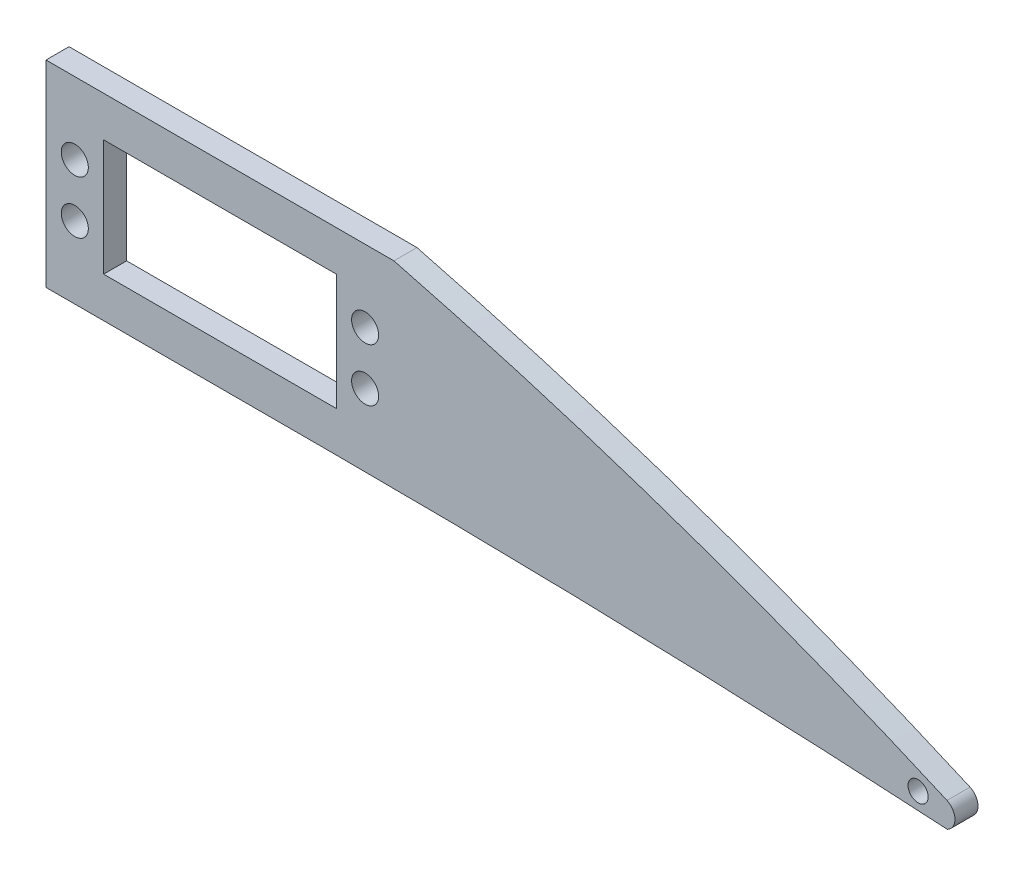
ISO-10303-21;
HEADER;
FILE_DESCRIPTION(('STEP AP214'),'2;1');
FILE_NAME('part.step','',(''),(''),'','','');
FILE_SCHEMA(('AUTOMOTIVE_DESIGN { 1 0 10303 214 1 1 1 1 }'));
ENDSEC;
DATA;
#1=APPLICATION_CONTEXT('core data for automotive mechanical design processes');
#2=APPLICATION_PROTOCOL_DEFINITION('international standard','automotive_design',2000,#1);
#3=PRODUCT_CONTEXT('',#1,'mechanical');
#4=PRODUCT('Part','Part','',(#3));
#5=PRODUCT_RELATED_PRODUCT_CATEGORY('part','',(#4));
#6=PRODUCT_DEFINITION_FORMATION('','',#4);
#7=PRODUCT_DEFINITION_CONTEXT('part definition',#1,'design');
#8=PRODUCT_DEFINITION('design','',#6,#7);
#9=PRODUCT_DEFINITION_SHAPE('','',#8);
#10=(LENGTH_UNIT() NAMED_UNIT(*) SI_UNIT(.MILLI.,.METRE.));
#11=(NAMED_UNIT(*) PLANE_ANGLE_UNIT() SI_UNIT($,.RADIAN.));
#12=(NAMED_UNIT(*) SI_UNIT($,.STERADIAN.) SOLID_ANGLE_UNIT());
#13=UNCERTAINTY_MEASURE_WITH_UNIT(LENGTH_MEASURE(1.E-05),#10,'distance_accuracy_value','');
#14=(GEOMETRIC_REPRESENTATION_CONTEXT(3) GLOBAL_UNCERTAINTY_ASSIGNED_CONTEXT((#13)) GLOBAL_UNIT_ASSIGNED_CONTEXT((#10,
#11,#12)) REPRESENTATION_CONTEXT('',''));
#15=CARTESIAN_POINT('',(0.,0.,0.));
#16=DIRECTION('',(0.,0.,1.));
#17=DIRECTION('',(1.,0.,0.));
#18=AXIS2_PLACEMENT_3D('',#15,#16,#17);
#19=CARTESIAN_POINT('',(125.2,-18.184180882781,4.));
#20=DIRECTION('',(0.,0.,-1.));
#21=DIRECTION('',(-1.,0.,0.));
#22=AXIS2_PLACEMENT_3D('',#19,#20,#21);
#23=PLANE('',#22);
#24=CARTESIAN_POINT('',(121.2,-17.1334379572919,4.));
#25=DIRECTION('',(0.,0.,1.));
#26=DIRECTION('',(1.,0.,0.));
#27=AXIS2_PLACEMENT_3D('',#24,#25,#26);
#28=CIRCLE('',#27,1.75);
#29=CARTESIAN_POINT('',(122.95,-17.1334379572919,4.));
#30=VERTEX_POINT('',#29);
#31=EDGE_CURVE('E168',#30,#30,#28,.T.);
#32=ORIENTED_EDGE('',*,*,#31,.F.);
#33=EDGE_LOOP('',(#32));
#34=FACE_BOUND('',#33,.T.);
#35=CARTESIAN_POINT('',(125.2,-18.184180882781,4.));
#36=DIRECTION('',(0.,0.,1.));
#37=DIRECTION('',(-1.,0.,0.));
#38=AXIS2_PLACEMENT_3D('',#35,#36,#37);
#39=CIRCLE('',#38,2.40054797434142);
#40=CARTESIAN_POINT('',(126.269263580591,-20.3334379572921,4.));
#41=VERTEX_POINT('',#40);
#42=CARTESIAN_POINT('',(126.216652739476,-16.0095434912992,4.));
#43=VERTEX_POINT('',#42);
#44=EDGE_CURVE('E176',#41,#43,#39,.T.);
#45=ORIENTED_EDGE('',*,*,#44,.T.);
#46=CARTESIAN_POINT('',(-123.166643251558,-583.435959333798,4.));
#47=DIRECTION('',(0.,0.,1.));
#48=DIRECTION('',(-1.,0.,0.));
#49=AXIS2_PLACEMENT_3D('',#46,#47,#48);
#50=CIRCLE('',#49,619.810265900151);
#51=CARTESIAN_POINT('',(30.2000000000001,17.1000000000001,4.));
#52=VERTEX_POINT('',#51);
#53=EDGE_CURVE('E180',#43,#52,#50,.T.);
#54=ORIENTED_EDGE('',*,*,#53,.T.);
#55=DIRECTION('',(-1.,0.,0.));
#56=VECTOR('',#55,1.);
#57=CARTESIAN_POINT('',(-30.2,17.1,4.));
#58=LINE('',#57,#56);
#59=CARTESIAN_POINT('',(-30.2,17.1,4.));
#60=VERTEX_POINT('',#59);
#61=EDGE_CURVE('E184',#52,#60,#58,.T.);
#62=ORIENTED_EDGE('',*,*,#61,.T.);
#63=DIRECTION('',(0.,-1.,0.));
#64=VECTOR('',#63,1.);
#65=CARTESIAN_POINT('',(-30.2,17.1,4.));
#66=LINE('',#65,#64);
#67=CARTESIAN_POINT('',(-30.2,-17.1,4.));
#68=VERTEX_POINT('',#67);
#69=EDGE_CURVE('E187',#60,#68,#66,.T.);
#70=ORIENTED_EDGE('',*,*,#69,.T.);
#71=DIRECTION('',(1.,0.,0.));
#72=VECTOR('',#71,1.);
#73=CARTESIAN_POINT('',(-30.2,-17.1,4.));
#74=LINE('',#73,#72);
#75=CARTESIAN_POINT('',(19.1973795010615,-17.1000000000001,4.));
#76=VERTEX_POINT('',#75);
#77=EDGE_CURVE('E190',#68,#76,#74,.T.);
#78=ORIENTED_EDGE('',*,*,#77,.T.);
#79=CARTESIAN_POINT('',(19.1973795010577,-1791.50291617273,4.));
#80=DIRECTION('',(0.,0.,-1.));
#81=DIRECTION('',(-1.,0.,0.));
#82=AXIS2_PLACEMENT_3D('',#79,#80,#81);
#83=CIRCLE('',#82,1774.40291617273);
#84=EDGE_CURVE('E193',#76,#41,#83,.T.);
#85=ORIENTED_EDGE('',*,*,#84,.T.);
#86=EDGE_LOOP('',(#45,#54,#62,#70,#78,#85));
#87=FACE_BOUND('',#86,.T.);
#88=DIRECTION('',(0.,-1.,0.));
#89=VECTOR('',#88,1.);
#90=CARTESIAN_POINT('',(-20.2,10.1,4.));
#91=LINE('',#90,#89);
#92=CARTESIAN_POINT('',(-20.2,10.1,4.));
#93=VERTEX_POINT('',#92);
#94=CARTESIAN_POINT('',(-20.2,-10.1,4.));
#95=VERTEX_POINT('',#94);
#96=EDGE_CURVE('E116',#93,#95,#91,.T.);
#97=ORIENTED_EDGE('',*,*,#96,.F.);
#98=DIRECTION('',(-1.,0.,0.));
#99=VECTOR('',#98,1.);
#100=CARTESIAN_POINT('',(-20.2,10.1,4.));
#101=LINE('',#100,#99);
#102=CARTESIAN_POINT('',(20.2,10.1,4.));
#103=VERTEX_POINT('',#102);
#104=EDGE_CURVE('E144',#103,#93,#101,.T.);
#105=ORIENTED_EDGE('',*,*,#104,.F.);
#106=DIRECTION('',(0.,1.,0.));
#107=VECTOR('',#106,1.);
#108=CARTESIAN_POINT('',(20.2,10.1,4.));
#109=LINE('',#108,#107);
#110=CARTESIAN_POINT('',(20.2,-10.1,4.));
#111=VERTEX_POINT('',#110);
#112=EDGE_CURVE('E139',#111,#103,#109,.T.);
#113=ORIENTED_EDGE('',*,*,#112,.F.);
#114=DIRECTION('',(1.,0.,0.));
#115=VECTOR('',#114,1.);
#116=CARTESIAN_POINT('',(-20.2,-10.1,4.));
#117=LINE('',#116,#115);
#118=EDGE_CURVE('E125',#95,#111,#117,.T.);
#119=ORIENTED_EDGE('',*,*,#118,.F.);
#120=EDGE_LOOP('',(#97,#105,#113,#119));
#121=FACE_BOUND('',#120,.T.);
#122=CARTESIAN_POINT('',(-25.2,4.6,4.));
#123=DIRECTION('',(0.,0.,1.));
#124=DIRECTION('',(1.,0.,0.));
#125=AXIS2_PLACEMENT_3D('',#122,#123,#124);
#126=CIRCLE('',#125,2.35);
#127=CARTESIAN_POINT('',(-22.85,4.6,4.));
#128=VERTEX_POINT('',#127);
#129=EDGE_CURVE('E152',#128,#128,#126,.T.);
#130=ORIENTED_EDGE('',*,*,#129,.F.);
#131=EDGE_LOOP('',(#130));
#132=FACE_BOUND('',#131,.T.);
#133=CARTESIAN_POINT('',(25.2,4.6,4.));
#134=DIRECTION('',(0.,0.,1.));
#135=DIRECTION('',(-1.,0.,0.));
#136=AXIS2_PLACEMENT_3D('',#133,#134,#135);
#137=CIRCLE('',#136,2.35);
#138=CARTESIAN_POINT('',(22.85,4.6,4.));
#139=VERTEX_POINT('',#138);
#140=EDGE_CURVE('E333',#139,#139,#137,.T.);
#141=ORIENTED_EDGE('',*,*,#140,.F.);
#142=EDGE_LOOP('',(#141));
#143=FACE_BOUND('',#142,.T.);
#144=CARTESIAN_POINT('',(25.2,-4.6,4.));
#145=DIRECTION('',(0.,0.,1.));
#146=DIRECTION('',(1.,0.,0.));
#147=AXIS2_PLACEMENT_3D('',#144,#145,#146);
#148=CIRCLE('',#147,2.35);
#149=CARTESIAN_POINT('',(27.55,-4.6,4.));
#150=VERTEX_POINT('',#149);
#151=EDGE_CURVE('E325',#150,#150,#148,.T.);
#152=ORIENTED_EDGE('',*,*,#151,.F.);
#153=EDGE_LOOP('',(#152));
#154=FACE_BOUND('',#153,.T.);
#155=CARTESIAN_POINT('',(-25.2,-4.6,4.));
#156=DIRECTION('',(0.,0.,1.));
#157=DIRECTION('',(-1.,0.,0.));
#158=AXIS2_PLACEMENT_3D('',#155,#156,#157);
#159=CIRCLE('',#158,2.35);
#160=CARTESIAN_POINT('',(-27.55,-4.6,4.));
#161=VERTEX_POINT('',#160);
#162=EDGE_CURVE('E313',#161,#161,#159,.T.);
#163=ORIENTED_EDGE('',*,*,#162,.F.);
#164=EDGE_LOOP('',(#163));
#165=FACE_BOUND('',#164,.T.);
#166=ADVANCED_FACE('F38',(#34,#87,#121,#132,#143,#154,#165),#23,.F.);
#167=CARTESIAN_POINT('',(125.2,-18.184180882781,0.));
#168=DIRECTION('',(0.,0.,-1.));
#169=DIRECTION('',(-1.,0.,0.));
#170=AXIS2_PLACEMENT_3D('',#167,#168,#169);
#171=PLANE('',#170);
#172=CARTESIAN_POINT('',(25.2,-4.6,0.));
#173=DIRECTION('',(0.,0.,1.));
#174=DIRECTION('',(1.,0.,0.));
#175=AXIS2_PLACEMENT_3D('',#172,#173,#174);
#176=CIRCLE('',#175,2.35);
#177=CARTESIAN_POINT('',(27.55,-4.6,0.));
#178=VERTEX_POINT('',#177);
#179=EDGE_CURVE('E322',#178,#178,#176,.T.);
#180=ORIENTED_EDGE('',*,*,#179,.T.);
#181=EDGE_LOOP('',(#180));
#182=FACE_BOUND('',#181,.T.);
#183=CARTESIAN_POINT('',(-25.2,4.6,0.));
#184=DIRECTION('',(0.,0.,1.));
#185=DIRECTION('',(1.,0.,0.));
#186=AXIS2_PLACEMENT_3D('',#183,#184,#185);
#187=CIRCLE('',#186,2.35);
#188=CARTESIAN_POINT('',(-22.85,4.6,0.));
#189=VERTEX_POINT('',#188);
#190=EDGE_CURVE('E337',#189,#189,#187,.T.);
#191=ORIENTED_EDGE('',*,*,#190,.T.);
#192=EDGE_LOOP('',(#191));
#193=FACE_BOUND('',#192,.T.);
#194=CARTESIAN_POINT('',(125.2,-18.184180882781,0.));
#195=DIRECTION('',(0.,0.,1.));
#196=DIRECTION('',(-1.,0.,0.));
#197=AXIS2_PLACEMENT_3D('',#194,#195,#196);
#198=CIRCLE('',#197,2.40054797434142);
#199=CARTESIAN_POINT('',(126.269263580591,-20.3334379572921,0.));
#200=VERTEX_POINT('',#199);
#201=CARTESIAN_POINT('',(126.216652739476,-16.0095434912992,0.));
#202=VERTEX_POINT('',#201);
#203=EDGE_CURVE('E172',#200,#202,#198,.T.);
#204=ORIENTED_EDGE('',*,*,#203,.F.);
#205=CARTESIAN_POINT('',(19.1973795010577,-1791.50291617273,0.));
#206=DIRECTION('',(0.,0.,-1.));
#207=DIRECTION('',(-1.,0.,0.));
#208=AXIS2_PLACEMENT_3D('',#205,#206,#207);
#209=CIRCLE('',#208,1774.40291617273);
#210=CARTESIAN_POINT('',(19.1973795010615,-17.1000000000001,0.));
#211=VERTEX_POINT('',#210);
#212=EDGE_CURVE('E181',#211,#200,#209,.T.);
#213=ORIENTED_EDGE('',*,*,#212,.F.);
#214=DIRECTION('',(1.,0.,0.));
#215=VECTOR('',#214,1.);
#216=CARTESIAN_POINT('',(-30.2,-17.1,0.));
#217=LINE('',#216,#215);
#218=CARTESIAN_POINT('',(-30.2,-17.1,0.));
#219=VERTEX_POINT('',#218);
#220=EDGE_CURVE('E209',#219,#211,#217,.T.);
#221=ORIENTED_EDGE('',*,*,#220,.F.);
#222=DIRECTION('',(0.,-1.,0.));
#223=VECTOR('',#222,1.);
#224=CARTESIAN_POINT('',(-30.2,17.1,0.));
#225=LINE('',#224,#223);
#226=CARTESIAN_POINT('',(-30.2,17.1,0.));
#227=VERTEX_POINT('',#226);
#228=EDGE_CURVE('E206',#227,#219,#225,.T.);
#229=ORIENTED_EDGE('',*,*,#228,.F.);
#230=DIRECTION('',(-1.,0.,0.));
#231=VECTOR('',#230,1.);
#232=CARTESIAN_POINT('',(-30.2,17.1,0.));
#233=LINE('',#232,#231);
#234=CARTESIAN_POINT('',(30.2000000000001,17.1000000000001,0.));
#235=VERTEX_POINT('',#234);
#236=EDGE_CURVE('E203',#235,#227,#233,.T.);
#237=ORIENTED_EDGE('',*,*,#236,.F.);
#238=CARTESIAN_POINT('',(-123.166643251558,-583.435959333798,0.));
#239=DIRECTION('',(0.,0.,1.));
#240=DIRECTION('',(-1.,0.,0.));
#241=AXIS2_PLACEMENT_3D('',#238,#239,#240);
#242=CIRCLE('',#241,619.810265900151);
#243=EDGE_CURVE('E200',#202,#235,#242,.T.);
#244=ORIENTED_EDGE('',*,*,#243,.F.);
#245=EDGE_LOOP('',(#204,#213,#221,#229,#237,#244));
#246=FACE_BOUND('',#245,.T.);
#247=CARTESIAN_POINT('',(121.2,-17.1334379572919,0.));
#248=DIRECTION('',(0.,0.,1.));
#249=DIRECTION('',(1.,0.,0.));
#250=AXIS2_PLACEMENT_3D('',#247,#248,#249);
#251=CIRCLE('',#250,1.75);
#252=CARTESIAN_POINT('',(122.95,-17.1334379572919,0.));
#253=VERTEX_POINT('',#252);
#254=EDGE_CURVE('E134',#253,#253,#251,.T.);
#255=ORIENTED_EDGE('',*,*,#254,.T.);
#256=EDGE_LOOP('',(#255));
#257=FACE_BOUND('',#256,.T.);
#258=DIRECTION('',(-1.,0.,0.));
#259=VECTOR('',#258,1.);
#260=CARTESIAN_POINT('',(-20.2,10.1,0.));
#261=LINE('',#260,#259);
#262=CARTESIAN_POINT('',(20.2,10.1,0.));
#263=VERTEX_POINT('',#262);
#264=CARTESIAN_POINT('',(-20.2,10.1,0.));
#265=VERTEX_POINT('',#264);
#266=EDGE_CURVE('E126',#263,#265,#261,.T.);
#267=ORIENTED_EDGE('',*,*,#266,.T.);
#268=DIRECTION('',(0.,-1.,0.));
#269=VECTOR('',#268,1.);
#270=CARTESIAN_POINT('',(-20.2,10.1,0.));
#271=LINE('',#270,#269);
#272=CARTESIAN_POINT('',(-20.2,-10.1,0.));
#273=VERTEX_POINT('',#272);
#274=EDGE_CURVE('E62',#265,#273,#271,.T.);
#275=ORIENTED_EDGE('',*,*,#274,.T.);
#276=DIRECTION('',(1.,0.,0.));
#277=VECTOR('',#276,1.);
#278=CARTESIAN_POINT('',(-20.2,-10.1,0.));
#279=LINE('',#278,#277);
#280=CARTESIAN_POINT('',(20.2,-10.1,0.));
#281=VERTEX_POINT('',#280);
#282=EDGE_CURVE('E132',#273,#281,#279,.T.);
#283=ORIENTED_EDGE('',*,*,#282,.T.);
#284=DIRECTION('',(0.,1.,0.));
#285=VECTOR('',#284,1.);
#286=CARTESIAN_POINT('',(20.2,10.1,0.));
#287=LINE('',#286,#285);
#288=EDGE_CURVE('E155',#281,#263,#287,.T.);
#289=ORIENTED_EDGE('',*,*,#288,.T.);
#290=EDGE_LOOP('',(#267,#275,#283,#289));
#291=FACE_BOUND('',#290,.T.);
#292=CARTESIAN_POINT('',(25.2,4.6,0.));
#293=DIRECTION('',(0.,0.,1.));
#294=DIRECTION('',(-1.,0.,0.));
#295=AXIS2_PLACEMENT_3D('',#292,#293,#294);
#296=CIRCLE('',#295,2.35);
#297=CARTESIAN_POINT('',(22.85,4.6,0.));
#298=VERTEX_POINT('',#297);
#299=EDGE_CURVE('E329',#298,#298,#296,.T.);
#300=ORIENTED_EDGE('',*,*,#299,.T.);
#301=EDGE_LOOP('',(#300));
#302=FACE_BOUND('',#301,.T.);
#303=CARTESIAN_POINT('',(-25.2,-4.6,0.));
#304=DIRECTION('',(0.,0.,1.));
#305=DIRECTION('',(-1.,0.,0.));
#306=AXIS2_PLACEMENT_3D('',#303,#304,#305);
#307=CIRCLE('',#306,2.35);
#308=CARTESIAN_POINT('',(-27.55,-4.6,0.));
#309=VERTEX_POINT('',#308);
#310=EDGE_CURVE('E316',#309,#309,#307,.T.);
#311=ORIENTED_EDGE('',*,*,#310,.T.);
#312=EDGE_LOOP('',(#311));
#313=FACE_BOUND('',#312,.T.);
#314=ADVANCED_FACE('F241',(#182,#193,#246,#257,#291,#302,#313),#171,.T.);
#315=CARTESIAN_POINT('',(125.2,-18.184180882781,4.));
#316=DIRECTION('',(0.,0.,-1.));
#317=DIRECTION('',(-1.,0.,0.));
#318=AXIS2_PLACEMENT_3D('',#315,#316,#317);
#319=CYLINDRICAL_SURFACE('',#318,2.40054797434142);
#320=ORIENTED_EDGE('',*,*,#203,.T.);
#321=DIRECTION('',(0.,0.,-1.));
#322=VECTOR('',#321,1.);
#323=CARTESIAN_POINT('',(126.216652739476,-16.0095434912992,4.));
#324=LINE('',#323,#322);
#325=EDGE_CURVE('E11',#43,#202,#324,.T.);
#326=ORIENTED_EDGE('',*,*,#325,.F.);
#327=ORIENTED_EDGE('',*,*,#44,.F.);
#328=DIRECTION('',(0.,0.,-1.));
#329=VECTOR('',#328,1.);
#330=CARTESIAN_POINT('',(126.269263580591,-20.3334379572921,4.));
#331=LINE('',#330,#329);
#332=EDGE_CURVE('E196',#41,#200,#331,.T.);
#333=ORIENTED_EDGE('',*,*,#332,.T.);
#334=EDGE_LOOP('',(#320,#326,#327,#333));
#335=FACE_BOUND('',#334,.T.);
#336=ADVANCED_FACE('F40',(#335),#319,.T.);
#337=CARTESIAN_POINT('',(-123.166643251558,-583.435959333798,4.));
#338=DIRECTION('',(0.,0.,-1.));
#339=DIRECTION('',(-1.,0.,0.));
#340=AXIS2_PLACEMENT_3D('',#337,#338,#339);
#341=CYLINDRICAL_SURFACE('',#340,619.810265900151);
#342=ORIENTED_EDGE('',*,*,#243,.T.);
#343=DIRECTION('',(0.,0.,-1.));
#344=VECTOR('',#343,1.);
#345=CARTESIAN_POINT('',(30.2000000000001,17.1000000000001,4.));
#346=LINE('',#345,#344);
#347=EDGE_CURVE('E47',#52,#235,#346,.T.);
#348=ORIENTED_EDGE('',*,*,#347,.F.);
#349=ORIENTED_EDGE('',*,*,#53,.F.);
#350=ORIENTED_EDGE('',*,*,#325,.T.);
#351=EDGE_LOOP('',(#342,#348,#349,#350));
#352=FACE_BOUND('',#351,.T.);
#353=ADVANCED_FACE('F258',(#352),#341,.T.);
#354=CARTESIAN_POINT('',(-30.2,17.1,4.));
#355=DIRECTION('',(0.,-1.,0.));
#356=DIRECTION('',(0.,0.,-1.));
#357=AXIS2_PLACEMENT_3D('',#354,#355,#356);
#358=PLANE('',#357);
#359=ORIENTED_EDGE('',*,*,#236,.T.);
#360=DIRECTION('',(0.,0.,-1.));
#361=VECTOR('',#360,1.);
#362=CARTESIAN_POINT('',(-30.2,17.1,4.));
#363=LINE('',#362,#361);
#364=EDGE_CURVE('E225',#60,#227,#363,.T.);
#365=ORIENTED_EDGE('',*,*,#364,.F.);
#366=ORIENTED_EDGE('',*,*,#61,.F.);
#367=ORIENTED_EDGE('',*,*,#347,.T.);
#368=EDGE_LOOP('',(#359,#365,#366,#367));
#369=FACE_BOUND('',#368,.T.);
#370=ADVANCED_FACE('F235',(#369),#358,.F.);
#371=CARTESIAN_POINT('',(-30.2,17.1,4.));
#372=DIRECTION('',(1.,0.,0.));
#373=DIRECTION('',(0.,1.,0.));
#374=AXIS2_PLACEMENT_3D('',#371,#372,#373);
#375=PLANE('',#374);
#376=ORIENTED_EDGE('',*,*,#228,.T.);
#377=DIRECTION('',(0.,0.,-1.));
#378=VECTOR('',#377,1.);
#379=CARTESIAN_POINT('',(-30.2,-17.1,4.));
#380=LINE('',#379,#378);
#381=EDGE_CURVE('E221',#68,#219,#380,.T.);
#382=ORIENTED_EDGE('',*,*,#381,.F.);
#383=ORIENTED_EDGE('',*,*,#69,.F.);
#384=ORIENTED_EDGE('',*,*,#364,.T.);
#385=EDGE_LOOP('',(#376,#382,#383,#384));
#386=FACE_BOUND('',#385,.T.);
#387=ADVANCED_FACE('F247',(#386),#375,.F.);
#388=CARTESIAN_POINT('',(-30.2,-17.1,4.));
#389=DIRECTION('',(0.,1.,0.));
#390=DIRECTION('',(-1.,0.,0.));
#391=AXIS2_PLACEMENT_3D('',#388,#389,#390);
#392=PLANE('',#391);
#393=ORIENTED_EDGE('',*,*,#220,.T.);
#394=DIRECTION('',(0.,0.,-1.));
#395=VECTOR('',#394,1.);
#396=CARTESIAN_POINT('',(19.1973795010615,-17.1000000000001,4.));
#397=LINE('',#396,#395);
#398=EDGE_CURVE('E217',#76,#211,#397,.T.);
#399=ORIENTED_EDGE('',*,*,#398,.F.);
#400=ORIENTED_EDGE('',*,*,#77,.F.);
#401=ORIENTED_EDGE('',*,*,#381,.T.);
#402=EDGE_LOOP('',(#393,#399,#400,#401));
#403=FACE_BOUND('',#402,.T.);
#404=ADVANCED_FACE('F251',(#403),#392,.F.);
#405=CARTESIAN_POINT('',(19.1973795010577,-1791.50291617273,4.));
#406=DIRECTION('',(0.,0.,-1.));
#407=DIRECTION('',(-1.,0.,0.));
#408=AXIS2_PLACEMENT_3D('',#405,#406,#407);
#409=CYLINDRICAL_SURFACE('',#408,1774.40291617273);
#410=ORIENTED_EDGE('',*,*,#212,.T.);
#411=ORIENTED_EDGE('',*,*,#332,.F.);
#412=ORIENTED_EDGE('',*,*,#84,.F.);
#413=ORIENTED_EDGE('',*,*,#398,.T.);
#414=EDGE_LOOP('',(#410,#411,#412,#413));
#415=FACE_BOUND('',#414,.T.);
#416=ADVANCED_FACE('F261',(#415),#409,.F.);
#417=CARTESIAN_POINT('',(121.2,-17.1334379572919,4.));
#418=DIRECTION('',(0.,0.,-1.));
#419=DIRECTION('',(-1.,0.,0.));
#420=AXIS2_PLACEMENT_3D('',#417,#418,#419);
#421=CYLINDRICAL_SURFACE('',#420,1.75);
#422=ORIENTED_EDGE('',*,*,#31,.T.);
#423=EDGE_LOOP('',(#422));
#424=FACE_BOUND('',#423,.T.);
#425=ORIENTED_EDGE('',*,*,#254,.F.);
#426=EDGE_LOOP('',(#425));
#427=FACE_BOUND('',#426,.T.);
#428=ADVANCED_FACE('F263',(#424,#427),#421,.F.);
#429=CARTESIAN_POINT('',(-20.2,10.1,4.));
#430=DIRECTION('',(1.,0.,0.));
#431=DIRECTION('',(0.,0.,-1.));
#432=AXIS2_PLACEMENT_3D('',#429,#430,#431);
#433=PLANE('',#432);
#434=ORIENTED_EDGE('',*,*,#274,.F.);
#435=DIRECTION('',(0.,0.,-1.));
#436=VECTOR('',#435,1.);
#437=CARTESIAN_POINT('',(-20.2,10.1,4.));
#438=LINE('',#437,#436);
#439=EDGE_CURVE('E120',#93,#265,#438,.T.);
#440=ORIENTED_EDGE('',*,*,#439,.F.);
#441=ORIENTED_EDGE('',*,*,#96,.T.);
#442=DIRECTION('',(0.,0.,-1.));
#443=VECTOR('',#442,1.);
#444=CARTESIAN_POINT('',(-20.2,-10.1,4.));
#445=LINE('',#444,#443);
#446=EDGE_CURVE('E119',#95,#273,#445,.T.);
#447=ORIENTED_EDGE('',*,*,#446,.T.);
#448=EDGE_LOOP('',(#434,#440,#441,#447));
#449=FACE_BOUND('',#448,.T.);
#450=ADVANCED_FACE('F118',(#449),#433,.T.);
#451=CARTESIAN_POINT('',(-20.2,-10.1,4.));
#452=DIRECTION('',(0.,1.,0.));
#453=DIRECTION('',(0.,0.,1.));
#454=AXIS2_PLACEMENT_3D('',#451,#452,#453);
#455=PLANE('',#454);
#456=ORIENTED_EDGE('',*,*,#282,.F.);
#457=ORIENTED_EDGE('',*,*,#446,.F.);
#458=ORIENTED_EDGE('',*,*,#118,.T.);
#459=DIRECTION('',(0.,0.,-1.));
#460=VECTOR('',#459,1.);
#461=CARTESIAN_POINT('',(20.2,-10.1,4.));
#462=LINE('',#461,#460);
#463=EDGE_CURVE('E135',#111,#281,#462,.T.);
#464=ORIENTED_EDGE('',*,*,#463,.T.);
#465=EDGE_LOOP('',(#456,#457,#458,#464));
#466=FACE_BOUND('',#465,.T.);
#467=ADVANCED_FACE('F129',(#466),#455,.T.);
#468=CARTESIAN_POINT('',(20.2,10.1,4.));
#469=DIRECTION('',(-1.,0.,0.));
#470=DIRECTION('',(0.,0.,1.));
#471=AXIS2_PLACEMENT_3D('',#468,#469,#470);
#472=PLANE('',#471);
#473=ORIENTED_EDGE('',*,*,#288,.F.);
#474=ORIENTED_EDGE('',*,*,#463,.F.);
#475=ORIENTED_EDGE('',*,*,#112,.T.);
#476=DIRECTION('',(0.,0.,-1.));
#477=VECTOR('',#476,1.);
#478=CARTESIAN_POINT('',(20.2,10.1,4.));
#479=LINE('',#478,#477);
#480=EDGE_CURVE('E54',#103,#263,#479,.T.);
#481=ORIENTED_EDGE('',*,*,#480,.T.);
#482=EDGE_LOOP('',(#473,#474,#475,#481));
#483=FACE_BOUND('',#482,.T.);
#484=ADVANCED_FACE('F286',(#483),#472,.T.);
#485=CARTESIAN_POINT('',(-20.2,10.1,4.));
#486=DIRECTION('',(0.,-1.,0.));
#487=DIRECTION('',(0.,0.,-1.));
#488=AXIS2_PLACEMENT_3D('',#485,#486,#487);
#489=PLANE('',#488);
#490=ORIENTED_EDGE('',*,*,#266,.F.);
#491=ORIENTED_EDGE('',*,*,#480,.F.);
#492=ORIENTED_EDGE('',*,*,#104,.T.);
#493=ORIENTED_EDGE('',*,*,#439,.T.);
#494=EDGE_LOOP('',(#490,#491,#492,#493));
#495=FACE_BOUND('',#494,.T.);
#496=ADVANCED_FACE('F289',(#495),#489,.T.);
#497=CARTESIAN_POINT('',(-25.2,4.6,4.));
#498=DIRECTION('',(0.,0.,-1.));
#499=DIRECTION('',(-1.,0.,0.));
#500=AXIS2_PLACEMENT_3D('',#497,#498,#499);
#501=CYLINDRICAL_SURFACE('',#500,2.35);
#502=ORIENTED_EDGE('',*,*,#129,.T.);
#503=EDGE_LOOP('',(#502));
#504=FACE_BOUND('',#503,.T.);
#505=ORIENTED_EDGE('',*,*,#190,.F.);
#506=EDGE_LOOP('',(#505));
#507=FACE_BOUND('',#506,.T.);
#508=ADVANCED_FACE('F293',(#504,#507),#501,.F.);
#509=CARTESIAN_POINT('',(25.2,4.6,4.));
#510=DIRECTION('',(0.,0.,-1.));
#511=DIRECTION('',(-1.,0.,0.));
#512=AXIS2_PLACEMENT_3D('',#509,#510,#511);
#513=CYLINDRICAL_SURFACE('',#512,2.35);
#514=ORIENTED_EDGE('',*,*,#140,.T.);
#515=EDGE_LOOP('',(#514));
#516=FACE_BOUND('',#515,.T.);
#517=ORIENTED_EDGE('',*,*,#299,.F.);
#518=EDGE_LOOP('',(#517));
#519=FACE_BOUND('',#518,.T.);
#520=ADVANCED_FACE('F296',(#516,#519),#513,.F.);
#521=CARTESIAN_POINT('',(25.2,-4.6,4.));
#522=DIRECTION('',(0.,0.,-1.));
#523=DIRECTION('',(-1.,0.,0.));
#524=AXIS2_PLACEMENT_3D('',#521,#522,#523);
#525=CYLINDRICAL_SURFACE('',#524,2.35);
#526=ORIENTED_EDGE('',*,*,#151,.T.);
#527=EDGE_LOOP('',(#526));
#528=FACE_BOUND('',#527,.T.);
#529=ORIENTED_EDGE('',*,*,#179,.F.);
#530=EDGE_LOOP('',(#529));
#531=FACE_BOUND('',#530,.T.);
#532=ADVANCED_FACE('F300',(#528,#531),#525,.F.);
#533=CARTESIAN_POINT('',(-25.2,-4.6,4.));
#534=DIRECTION('',(0.,0.,-1.));
#535=DIRECTION('',(-1.,0.,0.));
#536=AXIS2_PLACEMENT_3D('',#533,#534,#535);
#537=CYLINDRICAL_SURFACE('',#536,2.35);
#538=ORIENTED_EDGE('',*,*,#162,.T.);
#539=EDGE_LOOP('',(#538));
#540=FACE_BOUND('',#539,.T.);
#541=ORIENTED_EDGE('',*,*,#310,.F.);
#542=EDGE_LOOP('',(#541));
#543=FACE_BOUND('',#542,.T.);
#544=ADVANCED_FACE('F304',(#540,#543),#537,.F.);
#545=CLOSED_SHELL('',(#166,#314,#336,#353,#370,#387,#404,#416,#428,#450,#467,#484,#496,#508,
#520,#532,#544));
#546=MANIFOLD_SOLID_BREP('B2',#545);
#547=ADVANCED_BREP_SHAPE_REPRESENTATION('',(#18,#546),#14);
#548=SHAPE_DEFINITION_REPRESENTATION(#9,#547);
ENDSEC;
END-ISO-10303-21;
